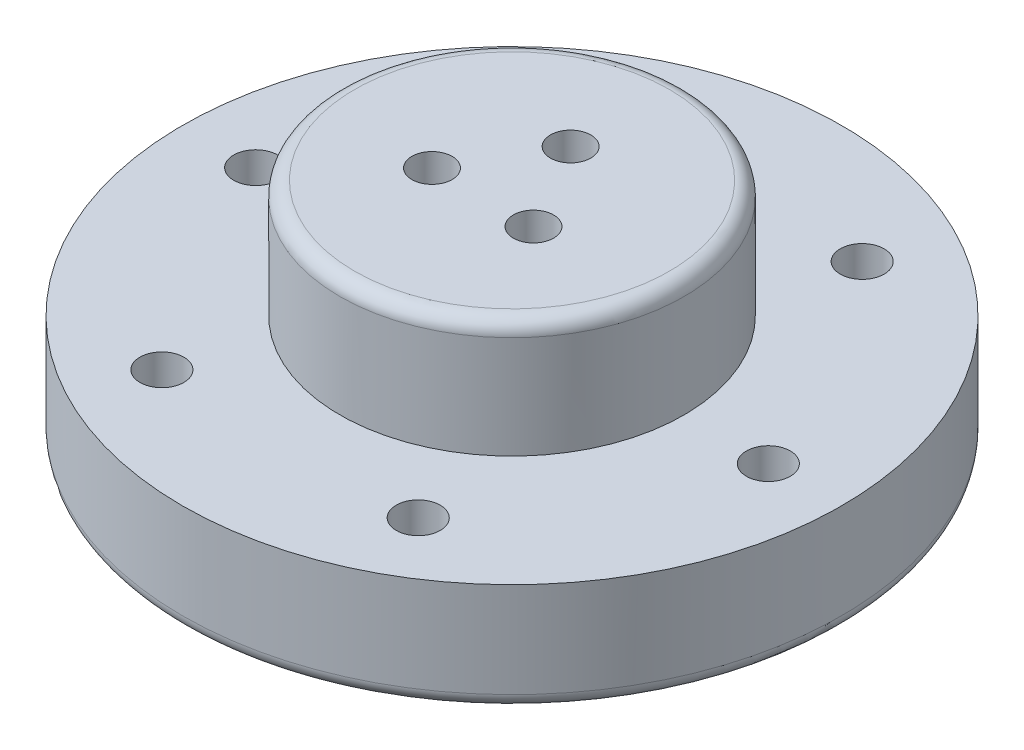
ISO-10303-21;
HEADER;
FILE_DESCRIPTION(('STEP AP214'),'2;1');
FILE_NAME('part.step','',(''),(''),'','','');
FILE_SCHEMA(('AUTOMOTIVE_DESIGN { 1 0 10303 214 1 1 1 1 }'));
ENDSEC;
DATA;
#1=APPLICATION_CONTEXT('core data for automotive mechanical design processes');
#2=APPLICATION_PROTOCOL_DEFINITION('international standard','automotive_design',2000,#1);
#3=PRODUCT_CONTEXT('',#1,'mechanical');
#4=PRODUCT('Part','Part','',(#3));
#5=PRODUCT_RELATED_PRODUCT_CATEGORY('part','',(#4));
#6=PRODUCT_DEFINITION_FORMATION('','',#4);
#7=PRODUCT_DEFINITION_CONTEXT('part definition',#1,'design');
#8=PRODUCT_DEFINITION('design','',#6,#7);
#9=PRODUCT_DEFINITION_SHAPE('','',#8);
#10=(LENGTH_UNIT() NAMED_UNIT(*) SI_UNIT(.MILLI.,.METRE.));
#11=(NAMED_UNIT(*) PLANE_ANGLE_UNIT() SI_UNIT($,.RADIAN.));
#12=(NAMED_UNIT(*) SI_UNIT($,.STERADIAN.) SOLID_ANGLE_UNIT());
#13=UNCERTAINTY_MEASURE_WITH_UNIT(LENGTH_MEASURE(1.E-05),#10,'distance_accuracy_value','');
#14=(GEOMETRIC_REPRESENTATION_CONTEXT(3) GLOBAL_UNCERTAINTY_ASSIGNED_CONTEXT((#13)) GLOBAL_UNIT_ASSIGNED_CONTEXT((#10,
#11,#12)) REPRESENTATION_CONTEXT('',''));
#15=CARTESIAN_POINT('',(0.,0.,0.));
#16=DIRECTION('',(0.,0.,1.));
#17=DIRECTION('',(1.,0.,0.));
#18=AXIS2_PLACEMENT_3D('',#15,#16,#17);
#19=CARTESIAN_POINT('',(0.,14.,0.));
#20=DIRECTION('',(0.,-1.,0.));
#21=DIRECTION('',(0.,0.,-1.));
#22=AXIS2_PLACEMENT_3D('',#19,#20,#21);
#23=CYLINDRICAL_SURFACE('',#22,23.5);
#24=CARTESIAN_POINT('',(0.,14.,0.));
#25=DIRECTION('',(0.,1.,0.));
#26=DIRECTION('',(0.,0.,1.));
#27=AXIS2_PLACEMENT_3D('',#24,#25,#26);
#28=CIRCLE('',#27,23.5);
#29=CARTESIAN_POINT('',(0.,14.,23.5));
#30=VERTEX_POINT('',#29);
#31=EDGE_CURVE('E53',#30,#30,#28,.F.);
#32=ORIENTED_EDGE('',*,*,#31,.T.);
#33=EDGE_LOOP('',(#32));
#34=FACE_BOUND('',#33,.T.);
#35=CARTESIAN_POINT('',(0.,0.,0.));
#36=DIRECTION('',(0.,-1.,0.));
#37=DIRECTION('',(0.,0.,-1.));
#38=AXIS2_PLACEMENT_3D('',#35,#36,#37);
#39=CIRCLE('',#38,23.5);
#40=CARTESIAN_POINT('',(0.,0.,-23.5));
#41=VERTEX_POINT('',#40);
#42=EDGE_CURVE('E96',#41,#41,#39,.T.);
#43=ORIENTED_EDGE('',*,*,#42,.F.);
#44=EDGE_LOOP('',(#43));
#45=FACE_BOUND('',#44,.T.);
#46=ADVANCED_FACE('F40',(#34,#45),#23,.T.);
#47=CARTESIAN_POINT('',(0.,-15.,0.));
#48=DIRECTION('',(0.,-1.,0.));
#49=DIRECTION('',(0.,0.,-1.));
#50=AXIS2_PLACEMENT_3D('',#47,#48,#49);
#51=PLANE('',#50);
#52=CARTESIAN_POINT('',(0.,-15.,0.));
#53=DIRECTION('',(0.,-1.,0.));
#54=DIRECTION('',(0.,0.,-1.));
#55=AXIS2_PLACEMENT_3D('',#52,#53,#54);
#56=CIRCLE('',#55,22.05);
#57=CARTESIAN_POINT('',(0.,-15.,-22.05));
#58=VERTEX_POINT('',#57);
#59=EDGE_CURVE('E10',#58,#58,#56,.F.);
#60=ORIENTED_EDGE('',*,*,#59,.T.);
#61=EDGE_LOOP('',(#60));
#62=FACE_BOUND('',#61,.T.);
#63=CARTESIAN_POINT('',(0.,-15.,0.));
#64=DIRECTION('',(0.,-1.,0.));
#65=DIRECTION('',(0.,0.,-1.));
#66=AXIS2_PLACEMENT_3D('',#63,#64,#65);
#67=CIRCLE('',#66,43.);
#68=CARTESIAN_POINT('',(0.,-15.,-43.));
#69=VERTEX_POINT('',#68);
#70=EDGE_CURVE('E64',#69,#69,#67,.T.);
#71=ORIENTED_EDGE('',*,*,#70,.T.);
#72=EDGE_LOOP('',(#71));
#73=FACE_BOUND('',#72,.T.);
#74=CARTESIAN_POINT('',(-17.4995000000004,-15.,30.3117551578589));
#75=DIRECTION('',(0.,1.,0.));
#76=DIRECTION('',(0.,0.,1.));
#77=AXIS2_PLACEMENT_3D('',#74,#75,#76);
#78=CIRCLE('',#77,3.);
#79=CARTESIAN_POINT('',(-17.4995000000004,-15.,33.3117551578589));
#80=VERTEX_POINT('',#79);
#81=EDGE_CURVE('E177',#80,#80,#78,.T.);
#82=ORIENTED_EDGE('',*,*,#81,.T.);
#83=EDGE_LOOP('',(#82));
#84=FACE_BOUND('',#83,.T.);
#85=CARTESIAN_POINT('',(17.5014999999997,-15.,30.3117551578593));
#86=DIRECTION('',(0.,1.,0.));
#87=DIRECTION('',(0.,0.,1.));
#88=AXIS2_PLACEMENT_3D('',#85,#86,#87);
#89=CIRCLE('',#88,3.);
#90=CARTESIAN_POINT('',(17.5014999999997,-15.,33.3117551578593));
#91=VERTEX_POINT('',#90);
#92=EDGE_CURVE('E169',#91,#91,#89,.T.);
#93=ORIENTED_EDGE('',*,*,#92,.T.);
#94=EDGE_LOOP('',(#93));
#95=FACE_BOUND('',#94,.T.);
#96=CARTESIAN_POINT('',(35.002,-15.,2.44410676681697E-13));
#97=DIRECTION('',(0.,1.,0.));
#98=DIRECTION('',(0.,0.,1.));
#99=AXIS2_PLACEMENT_3D('',#96,#97,#98);
#100=CIRCLE('',#99,3.);
#101=CARTESIAN_POINT('',(35.002,-15.,3.00000000000025));
#102=VERTEX_POINT('',#101);
#103=EDGE_CURVE('E161',#102,#102,#100,.T.);
#104=ORIENTED_EDGE('',*,*,#103,.T.);
#105=EDGE_LOOP('',(#104));
#106=FACE_BOUND('',#105,.T.);
#107=CARTESIAN_POINT('',(17.5015000000001,-15.,-30.3117551578591));
#108=DIRECTION('',(0.,1.,0.));
#109=DIRECTION('',(0.,0.,1.));
#110=AXIS2_PLACEMENT_3D('',#107,#108,#109);
#111=CIRCLE('',#110,3.);
#112=CARTESIAN_POINT('',(17.5015000000001,-15.,-27.3117551578591));
#113=VERTEX_POINT('',#112);
#114=EDGE_CURVE('E153',#113,#113,#111,.T.);
#115=ORIENTED_EDGE('',*,*,#114,.T.);
#116=EDGE_LOOP('',(#115));
#117=FACE_BOUND('',#116,.T.);
#118=CARTESIAN_POINT('',(-17.4994999999999,-15.,-30.3117551578592));
#119=DIRECTION('',(0.,1.,0.));
#120=DIRECTION('',(0.,0.,1.));
#121=AXIS2_PLACEMENT_3D('',#118,#119,#120);
#122=CIRCLE('',#121,3.);
#123=CARTESIAN_POINT('',(-17.4994999999999,-15.,-27.3117551578592));
#124=VERTEX_POINT('',#123);
#125=EDGE_CURVE('E145',#124,#124,#122,.T.);
#126=ORIENTED_EDGE('',*,*,#125,.T.);
#127=EDGE_LOOP('',(#126));
#128=FACE_BOUND('',#127,.T.);
#129=CARTESIAN_POINT('',(-35.,-15.,0.));
#130=DIRECTION('',(0.,1.,0.));
#131=DIRECTION('',(0.,0.,1.));
#132=AXIS2_PLACEMENT_3D('',#129,#130,#131);
#133=CIRCLE('',#132,3.);
#134=CARTESIAN_POINT('',(-35.,-15.,3.));
#135=VERTEX_POINT('',#134);
#136=EDGE_CURVE('E140',#135,#135,#133,.T.);
#137=ORIENTED_EDGE('',*,*,#136,.T.);
#138=EDGE_LOOP('',(#137));
#139=FACE_BOUND('',#138,.T.);
#140=ADVANCED_FACE('F189',(#62,#73,#84,#95,#106,#117,#128,#139),#51,.T.);
#141=CARTESIAN_POINT('',(0.,0.,0.));
#142=DIRECTION('',(0.,-1.,0.));
#143=DIRECTION('',(0.,0.,-1.));
#144=AXIS2_PLACEMENT_3D('',#141,#142,#143);
#145=PLANE('',#144);
#146=ORIENTED_EDGE('',*,*,#42,.T.);
#147=EDGE_LOOP('',(#146));
#148=FACE_BOUND('',#147,.T.);
#149=CARTESIAN_POINT('',(-17.4995000000004,0.,30.3117551578589));
#150=DIRECTION('',(0.,1.,0.));
#151=DIRECTION('',(0.,0.,1.));
#152=AXIS2_PLACEMENT_3D('',#149,#150,#151);
#153=CIRCLE('',#152,3.);
#154=CARTESIAN_POINT('',(-17.4995000000004,0.,33.3117551578589));
#155=VERTEX_POINT('',#154);
#156=EDGE_CURVE('E181',#155,#155,#153,.T.);
#157=ORIENTED_EDGE('',*,*,#156,.F.);
#158=EDGE_LOOP('',(#157));
#159=FACE_BOUND('',#158,.T.);
#160=CARTESIAN_POINT('',(17.5014999999997,0.,30.3117551578593));
#161=DIRECTION('',(0.,1.,0.));
#162=DIRECTION('',(0.,0.,1.));
#163=AXIS2_PLACEMENT_3D('',#160,#161,#162);
#164=CIRCLE('',#163,3.);
#165=CARTESIAN_POINT('',(17.5014999999997,0.,33.3117551578593));
#166=VERTEX_POINT('',#165);
#167=EDGE_CURVE('E173',#166,#166,#164,.T.);
#168=ORIENTED_EDGE('',*,*,#167,.F.);
#169=EDGE_LOOP('',(#168));
#170=FACE_BOUND('',#169,.T.);
#171=CARTESIAN_POINT('',(35.002,0.,2.44410676681697E-13));
#172=DIRECTION('',(0.,1.,0.));
#173=DIRECTION('',(0.,0.,1.));
#174=AXIS2_PLACEMENT_3D('',#171,#172,#173);
#175=CIRCLE('',#174,3.);
#176=CARTESIAN_POINT('',(35.002,0.,3.00000000000025));
#177=VERTEX_POINT('',#176);
#178=EDGE_CURVE('E165',#177,#177,#175,.T.);
#179=ORIENTED_EDGE('',*,*,#178,.F.);
#180=EDGE_LOOP('',(#179));
#181=FACE_BOUND('',#180,.T.);
#182=CARTESIAN_POINT('',(17.5015000000001,0.,-30.3117551578591));
#183=DIRECTION('',(0.,1.,0.));
#184=DIRECTION('',(0.,0.,1.));
#185=AXIS2_PLACEMENT_3D('',#182,#183,#184);
#186=CIRCLE('',#185,3.);
#187=CARTESIAN_POINT('',(17.5015000000001,0.,-27.3117551578591));
#188=VERTEX_POINT('',#187);
#189=EDGE_CURVE('E157',#188,#188,#186,.T.);
#190=ORIENTED_EDGE('',*,*,#189,.F.);
#191=EDGE_LOOP('',(#190));
#192=FACE_BOUND('',#191,.T.);
#193=CARTESIAN_POINT('',(-17.4994999999999,0.,-30.3117551578592));
#194=DIRECTION('',(0.,1.,0.));
#195=DIRECTION('',(0.,0.,1.));
#196=AXIS2_PLACEMENT_3D('',#193,#194,#195);
#197=CIRCLE('',#196,3.);
#198=CARTESIAN_POINT('',(-17.4994999999999,0.,-27.3117551578592));
#199=VERTEX_POINT('',#198);
#200=EDGE_CURVE('E149',#199,#199,#197,.T.);
#201=ORIENTED_EDGE('',*,*,#200,.F.);
#202=EDGE_LOOP('',(#201));
#203=FACE_BOUND('',#202,.T.);
#204=CARTESIAN_POINT('',(-35.,0.,0.));
#205=DIRECTION('',(0.,1.,0.));
#206=DIRECTION('',(0.,0.,1.));
#207=AXIS2_PLACEMENT_3D('',#204,#205,#206);
#208=CIRCLE('',#207,3.);
#209=CARTESIAN_POINT('',(-35.,0.,3.));
#210=VERTEX_POINT('',#209);
#211=EDGE_CURVE('E141',#210,#210,#208,.T.);
#212=ORIENTED_EDGE('',*,*,#211,.F.);
#213=EDGE_LOOP('',(#212));
#214=FACE_BOUND('',#213,.T.);
#215=CARTESIAN_POINT('',(0.,0.,0.));
#216=DIRECTION('',(0.,1.,0.));
#217=DIRECTION('',(0.,0.,1.));
#218=AXIS2_PLACEMENT_3D('',#215,#216,#217);
#219=CIRCLE('',#218,45.);
#220=CARTESIAN_POINT('',(0.,0.,45.));
#221=VERTEX_POINT('',#220);
#222=EDGE_CURVE('E130',#221,#221,#219,.T.);
#223=ORIENTED_EDGE('',*,*,#222,.T.);
#224=EDGE_LOOP('',(#223));
#225=FACE_BOUND('',#224,.T.);
#226=ADVANCED_FACE('F200',(#148,#159,#170,#181,#192,#203,#214,#225),#145,.F.);
#227=CARTESIAN_POINT('',(0.,-15.,0.));
#228=DIRECTION('',(0.,1.,0.));
#229=DIRECTION('',(0.,0.,1.));
#230=AXIS2_PLACEMENT_3D('',#227,#228,#229);
#231=CYLINDRICAL_SURFACE('',#230,21.05);
#232=CARTESIAN_POINT('',(0.,-14.,0.));
#233=DIRECTION('',(0.,-1.,0.));
#234=DIRECTION('',(0.,0.,-1.));
#235=AXIS2_PLACEMENT_3D('',#232,#233,#234);
#236=CIRCLE('',#235,21.05);
#237=CARTESIAN_POINT('',(0.,-14.,-21.05));
#238=VERTEX_POINT('',#237);
#239=EDGE_CURVE('E48',#238,#238,#236,.T.);
#240=ORIENTED_EDGE('',*,*,#239,.T.);
#241=EDGE_LOOP('',(#240));
#242=FACE_BOUND('',#241,.T.);
#243=CARTESIAN_POINT('',(0.,0.,0.));
#244=DIRECTION('',(0.,-1.,0.));
#245=DIRECTION('',(0.,0.,-1.));
#246=AXIS2_PLACEMENT_3D('',#243,#244,#245);
#247=CIRCLE('',#246,21.05);
#248=CARTESIAN_POINT('',(0.,0.,-21.05));
#249=VERTEX_POINT('',#248);
#250=EDGE_CURVE('E100',#249,#249,#247,.T.);
#251=ORIENTED_EDGE('',*,*,#250,.F.);
#252=EDGE_LOOP('',(#251));
#253=FACE_BOUND('',#252,.T.);
#254=ADVANCED_FACE('F203',(#242,#253),#231,.F.);
#255=CARTESIAN_POINT('',(0.,0.,0.));
#256=DIRECTION('',(0.,1.,0.));
#257=DIRECTION('',(0.,0.,1.));
#258=AXIS2_PLACEMENT_3D('',#255,#256,#257);
#259=PLANE('',#258);
#260=CARTESIAN_POINT('',(0.,0.,-8.));
#261=DIRECTION('',(0.,-1.,0.));
#262=DIRECTION('',(0.,0.,-1.));
#263=AXIS2_PLACEMENT_3D('',#260,#261,#262);
#264=CIRCLE('',#263,1.5);
#265=CARTESIAN_POINT('',(0.,0.,-9.5));
#266=VERTEX_POINT('',#265);
#267=EDGE_CURVE('E109',#266,#266,#264,.T.);
#268=ORIENTED_EDGE('',*,*,#267,.F.);
#269=EDGE_LOOP('',(#268));
#270=FACE_BOUND('',#269,.T.);
#271=CARTESIAN_POINT('',(-6.92820323027602,0.,3.9999999999997));
#272=DIRECTION('',(0.,-1.,0.));
#273=DIRECTION('',(0.,0.,-1.));
#274=AXIS2_PLACEMENT_3D('',#271,#272,#273);
#275=CIRCLE('',#274,1.50000000000044);
#276=CARTESIAN_POINT('',(-6.92820323027602,0.,2.49999999999927));
#277=VERTEX_POINT('',#276);
#278=EDGE_CURVE('E117',#277,#277,#275,.T.);
#279=ORIENTED_EDGE('',*,*,#278,.F.);
#280=EDGE_LOOP('',(#279));
#281=FACE_BOUND('',#280,.T.);
#282=CARTESIAN_POINT('',(6.928203230275,0.,4.0000000000003));
#283=DIRECTION('',(0.,-1.,0.));
#284=DIRECTION('',(0.,0.,-1.));
#285=AXIS2_PLACEMENT_3D('',#282,#283,#284);
#286=CIRCLE('',#285,1.50000000000065);
#287=CARTESIAN_POINT('',(6.928203230275,0.,2.49999999999965));
#288=VERTEX_POINT('',#287);
#289=EDGE_CURVE('E113',#288,#288,#286,.T.);
#290=ORIENTED_EDGE('',*,*,#289,.F.);
#291=EDGE_LOOP('',(#290));
#292=FACE_BOUND('',#291,.T.);
#293=CARTESIAN_POINT('',(0.,0.,0.));
#294=DIRECTION('',(0.,-1.,0.));
#295=DIRECTION('',(0.,0.,-1.));
#296=AXIS2_PLACEMENT_3D('',#293,#294,#295);
#297=CIRCLE('',#296,5.65);
#298=CARTESIAN_POINT('',(0.,0.,-5.65));
#299=VERTEX_POINT('',#298);
#300=EDGE_CURVE('E105',#299,#299,#297,.T.);
#301=ORIENTED_EDGE('',*,*,#300,.F.);
#302=EDGE_LOOP('',(#301));
#303=FACE_BOUND('',#302,.T.);
#304=ORIENTED_EDGE('',*,*,#250,.T.);
#305=EDGE_LOOP('',(#304));
#306=FACE_BOUND('',#305,.T.);
#307=ADVANCED_FACE('F248',(#270,#281,#292,#303,#306),#259,.F.);
#308=CARTESIAN_POINT('',(0.,7.5,0.));
#309=DIRECTION('',(0.,-1.,0.));
#310=DIRECTION('',(0.,0.,-1.));
#311=AXIS2_PLACEMENT_3D('',#308,#309,#310);
#312=CYLINDRICAL_SURFACE('',#311,5.65);
#313=CARTESIAN_POINT('',(0.,7.5,0.));
#314=DIRECTION('',(0.,-1.,0.));
#315=DIRECTION('',(0.,0.,-1.));
#316=AXIS2_PLACEMENT_3D('',#313,#314,#315);
#317=CIRCLE('',#316,5.65);
#318=CARTESIAN_POINT('',(0.,7.5,-5.65));
#319=VERTEX_POINT('',#318);
#320=EDGE_CURVE('E104',#319,#319,#317,.T.);
#321=ORIENTED_EDGE('',*,*,#320,.F.);
#322=EDGE_LOOP('',(#321));
#323=FACE_BOUND('',#322,.T.);
#324=ORIENTED_EDGE('',*,*,#300,.T.);
#325=EDGE_LOOP('',(#324));
#326=FACE_BOUND('',#325,.T.);
#327=ADVANCED_FACE('F315',(#323,#326),#312,.F.);
#328=CARTESIAN_POINT('',(0.,7.5,0.));
#329=DIRECTION('',(0.,-1.,0.));
#330=DIRECTION('',(0.,0.,-1.));
#331=AXIS2_PLACEMENT_3D('',#328,#329,#330);
#332=PLANE('',#331);
#333=ORIENTED_EDGE('',*,*,#320,.T.);
#334=EDGE_LOOP('',(#333));
#335=FACE_BOUND('',#334,.T.);
#336=ADVANCED_FACE('F311',(#335),#332,.T.);
#337=CARTESIAN_POINT('',(6.928203230275,7.5,4.0000000000003));
#338=DIRECTION('',(0.,-1.,0.));
#339=DIRECTION('',(0.,0.,-1.));
#340=AXIS2_PLACEMENT_3D('',#337,#338,#339);
#341=CYLINDRICAL_SURFACE('',#340,1.50000000000065);
#342=CARTESIAN_POINT('',(6.928203230275,8.69999999999998,4.0000000000003));
#343=DIRECTION('',(0.,1.,0.));
#344=DIRECTION('',(0.,0.,1.));
#345=AXIS2_PLACEMENT_3D('',#342,#343,#344);
#346=CIRCLE('',#345,1.50000000000065);
#347=CARTESIAN_POINT('',(6.928203230275,8.69999999999998,5.50000000000095));
#348=VERTEX_POINT('',#347);
#349=EDGE_CURVE('E84',#348,#348,#346,.T.);
#350=ORIENTED_EDGE('',*,*,#349,.T.);
#351=EDGE_LOOP('',(#350));
#352=FACE_BOUND('',#351,.T.);
#353=ORIENTED_EDGE('',*,*,#289,.T.);
#354=EDGE_LOOP('',(#353));
#355=FACE_BOUND('',#354,.T.);
#356=ADVANCED_FACE('F307',(#352,#355),#341,.F.);
#357=CARTESIAN_POINT('',(-6.92820323027602,7.5,3.9999999999997));
#358=DIRECTION('',(0.,-1.,0.));
#359=DIRECTION('',(0.,0.,-1.));
#360=AXIS2_PLACEMENT_3D('',#357,#358,#359);
#361=CYLINDRICAL_SURFACE('',#360,1.50000000000044);
#362=CARTESIAN_POINT('',(-6.92820323027602,8.69999999999998,3.9999999999997));
#363=DIRECTION('',(0.,1.,0.));
#364=DIRECTION('',(0.,0.,1.));
#365=AXIS2_PLACEMENT_3D('',#362,#363,#364);
#366=CIRCLE('',#365,1.50000000000044);
#367=CARTESIAN_POINT('',(-6.92820323027602,8.69999999999998,5.50000000000014));
#368=VERTEX_POINT('',#367);
#369=EDGE_CURVE('E88',#368,#368,#366,.T.);
#370=ORIENTED_EDGE('',*,*,#369,.T.);
#371=EDGE_LOOP('',(#370));
#372=FACE_BOUND('',#371,.T.);
#373=ORIENTED_EDGE('',*,*,#278,.T.);
#374=EDGE_LOOP('',(#373));
#375=FACE_BOUND('',#374,.T.);
#376=ADVANCED_FACE('F303',(#372,#375),#361,.F.);
#377=CARTESIAN_POINT('',(0.,7.5,-8.));
#378=DIRECTION('',(0.,-1.,0.));
#379=DIRECTION('',(0.,0.,-1.));
#380=AXIS2_PLACEMENT_3D('',#377,#378,#379);
#381=CYLINDRICAL_SURFACE('',#380,1.5);
#382=CARTESIAN_POINT('',(0.,8.69999999999998,-8.));
#383=DIRECTION('',(0.,1.,0.));
#384=DIRECTION('',(0.,0.,1.));
#385=AXIS2_PLACEMENT_3D('',#382,#383,#384);
#386=CIRCLE('',#385,1.5);
#387=CARTESIAN_POINT('',(0.,8.69999999999998,-6.5));
#388=VERTEX_POINT('',#387);
#389=EDGE_CURVE('E92',#388,#388,#386,.T.);
#390=ORIENTED_EDGE('',*,*,#389,.T.);
#391=EDGE_LOOP('',(#390));
#392=FACE_BOUND('',#391,.T.);
#393=ORIENTED_EDGE('',*,*,#267,.T.);
#394=EDGE_LOOP('',(#393));
#395=FACE_BOUND('',#394,.T.);
#396=ADVANCED_FACE('F282',(#392,#395),#381,.F.);
#397=CARTESIAN_POINT('',(0.,16.,0.));
#398=DIRECTION('',(0.,1.,0.));
#399=DIRECTION('',(0.,0.,1.));
#400=AXIS2_PLACEMENT_3D('',#397,#398,#399);
#401=PLANE('',#400);
#402=CARTESIAN_POINT('',(0.,16.,0.));
#403=DIRECTION('',(0.,1.,0.));
#404=DIRECTION('',(0.,0.,1.));
#405=AXIS2_PLACEMENT_3D('',#402,#403,#404);
#406=CIRCLE('',#405,21.5);
#407=CARTESIAN_POINT('',(0.,16.,21.5));
#408=VERTEX_POINT('',#407);
#409=EDGE_CURVE('E58',#408,#408,#406,.T.);
#410=ORIENTED_EDGE('',*,*,#409,.T.);
#411=EDGE_LOOP('',(#410));
#412=FACE_BOUND('',#411,.T.);
#413=CARTESIAN_POINT('',(0.,16.,-8.));
#414=DIRECTION('',(0.,1.,0.));
#415=DIRECTION('',(0.,0.,1.));
#416=AXIS2_PLACEMENT_3D('',#413,#414,#415);
#417=CIRCLE('',#416,2.75);
#418=CARTESIAN_POINT('',(0.,16.,-5.25));
#419=VERTEX_POINT('',#418);
#420=EDGE_CURVE('E118',#419,#419,#417,.T.);
#421=ORIENTED_EDGE('',*,*,#420,.F.);
#422=EDGE_LOOP('',(#421));
#423=FACE_BOUND('',#422,.T.);
#424=CARTESIAN_POINT('',(6.928203230275,16.,4.0000000000003));
#425=DIRECTION('',(0.,1.,0.));
#426=DIRECTION('',(0.,0.,1.));
#427=AXIS2_PLACEMENT_3D('',#424,#425,#426);
#428=CIRCLE('',#427,2.75);
#429=CARTESIAN_POINT('',(6.928203230275,16.,6.7500000000003));
#430=VERTEX_POINT('',#429);
#431=EDGE_CURVE('E129',#430,#430,#428,.T.);
#432=ORIENTED_EDGE('',*,*,#431,.F.);
#433=EDGE_LOOP('',(#432));
#434=FACE_BOUND('',#433,.T.);
#435=CARTESIAN_POINT('',(-6.92820323027602,16.,3.9999999999997));
#436=DIRECTION('',(0.,1.,0.));
#437=DIRECTION('',(0.,0.,1.));
#438=AXIS2_PLACEMENT_3D('',#435,#436,#437);
#439=CIRCLE('',#438,2.75);
#440=CARTESIAN_POINT('',(-6.92820323027602,16.,6.7499999999997));
#441=VERTEX_POINT('',#440);
#442=EDGE_CURVE('E125',#441,#441,#439,.T.);
#443=ORIENTED_EDGE('',*,*,#442,.F.);
#444=EDGE_LOOP('',(#443));
#445=FACE_BOUND('',#444,.T.);
#446=ADVANCED_FACE('F279',(#412,#423,#434,#445),#401,.T.);
#447=CARTESIAN_POINT('',(-6.92820323027602,10.,3.9999999999997));
#448=DIRECTION('',(0.,1.,0.));
#449=DIRECTION('',(0.,0.,1.));
#450=AXIS2_PLACEMENT_3D('',#447,#448,#449);
#451=CYLINDRICAL_SURFACE('',#450,2.75);
#452=CARTESIAN_POINT('',(-6.92820323027602,9.94999999999955,3.9999999999997));
#453=DIRECTION('',(0.,1.,0.));
#454=DIRECTION('',(0.,0.,1.));
#455=AXIS2_PLACEMENT_3D('',#452,#453,#454);
#456=CIRCLE('',#455,2.75);
#457=CARTESIAN_POINT('',(-6.92820323027602,9.94999999999955,6.7499999999997));
#458=VERTEX_POINT('',#457);
#459=EDGE_CURVE('E76',#458,#458,#456,.F.);
#460=ORIENTED_EDGE('',*,*,#459,.T.);
#461=EDGE_LOOP('',(#460));
#462=FACE_BOUND('',#461,.T.);
#463=ORIENTED_EDGE('',*,*,#442,.T.);
#464=EDGE_LOOP('',(#463));
#465=FACE_BOUND('',#464,.T.);
#466=ADVANCED_FACE('F281',(#462,#465),#451,.F.);
#467=CARTESIAN_POINT('',(6.928203230275,10.,4.0000000000003));
#468=DIRECTION('',(0.,1.,0.));
#469=DIRECTION('',(0.,0.,1.));
#470=AXIS2_PLACEMENT_3D('',#467,#468,#469);
#471=CYLINDRICAL_SURFACE('',#470,2.75);
#472=CARTESIAN_POINT('',(6.928203230275,9.94999999999934,4.0000000000003));
#473=DIRECTION('',(0.,1.,0.));
#474=DIRECTION('',(0.,0.,1.));
#475=AXIS2_PLACEMENT_3D('',#472,#473,#474);
#476=CIRCLE('',#475,2.75);
#477=CARTESIAN_POINT('',(6.928203230275,9.94999999999934,6.7500000000003));
#478=VERTEX_POINT('',#477);
#479=EDGE_CURVE('E72',#478,#478,#476,.F.);
#480=ORIENTED_EDGE('',*,*,#479,.T.);
#481=EDGE_LOOP('',(#480));
#482=FACE_BOUND('',#481,.T.);
#483=ORIENTED_EDGE('',*,*,#431,.T.);
#484=EDGE_LOOP('',(#483));
#485=FACE_BOUND('',#484,.T.);
#486=ADVANCED_FACE('F291',(#482,#485),#471,.F.);
#487=CARTESIAN_POINT('',(0.,10.,-8.));
#488=DIRECTION('',(0.,1.,0.));
#489=DIRECTION('',(0.,0.,1.));
#490=AXIS2_PLACEMENT_3D('',#487,#488,#489);
#491=CYLINDRICAL_SURFACE('',#490,2.75);
#492=CARTESIAN_POINT('',(0.,9.94999999999999,-8.));
#493=DIRECTION('',(0.,1.,0.));
#494=DIRECTION('',(0.,0.,1.));
#495=AXIS2_PLACEMENT_3D('',#492,#493,#494);
#496=CIRCLE('',#495,2.75);
#497=CARTESIAN_POINT('',(0.,9.94999999999999,-5.25));
#498=VERTEX_POINT('',#497);
#499=EDGE_CURVE('E80',#498,#498,#496,.F.);
#500=ORIENTED_EDGE('',*,*,#499,.T.);
#501=EDGE_LOOP('',(#500));
#502=FACE_BOUND('',#501,.T.);
#503=ORIENTED_EDGE('',*,*,#420,.T.);
#504=EDGE_LOOP('',(#503));
#505=FACE_BOUND('',#504,.T.);
#506=ADVANCED_FACE('F256',(#502,#505),#491,.F.);
#507=CARTESIAN_POINT('',(0.,8.69999999999998,-8.));
#508=DIRECTION('',(0.,1.,0.));
#509=DIRECTION('',(0.,0.,1.));
#510=AXIS2_PLACEMENT_3D('',#507,#508,#509);
#511=CONICAL_SURFACE('',#510,1.5,0.785398163397443);
#512=ORIENTED_EDGE('',*,*,#499,.F.);
#513=EDGE_LOOP('',(#512));
#514=FACE_BOUND('',#513,.T.);
#515=ORIENTED_EDGE('',*,*,#389,.F.);
#516=EDGE_LOOP('',(#515));
#517=FACE_BOUND('',#516,.T.);
#518=ADVANCED_FACE('F250',(#514,#517),#511,.F.);
#519=CARTESIAN_POINT('',(-6.92820323027602,8.69999999999998,3.9999999999997));
#520=DIRECTION('',(0.,1.,0.));
#521=DIRECTION('',(0.,0.,1.));
#522=AXIS2_PLACEMENT_3D('',#519,#520,#521);
#523=CONICAL_SURFACE('',#522,1.50000000000044,0.785398163397443);
#524=ORIENTED_EDGE('',*,*,#459,.F.);
#525=EDGE_LOOP('',(#524));
#526=FACE_BOUND('',#525,.T.);
#527=ORIENTED_EDGE('',*,*,#369,.F.);
#528=EDGE_LOOP('',(#527));
#529=FACE_BOUND('',#528,.T.);
#530=ADVANCED_FACE('F233',(#526,#529),#523,.F.);
#531=CARTESIAN_POINT('',(6.928203230275,8.69999999999998,4.0000000000003));
#532=DIRECTION('',(0.,1.,0.));
#533=DIRECTION('',(0.,0.,1.));
#534=AXIS2_PLACEMENT_3D('',#531,#532,#533);
#535=CONICAL_SURFACE('',#534,1.50000000000065,0.785398163397443);
#536=ORIENTED_EDGE('',*,*,#479,.F.);
#537=EDGE_LOOP('',(#536));
#538=FACE_BOUND('',#537,.T.);
#539=ORIENTED_EDGE('',*,*,#349,.F.);
#540=EDGE_LOOP('',(#539));
#541=FACE_BOUND('',#540,.T.);
#542=ADVANCED_FACE('F221',(#538,#541),#535,.F.);
#543=CARTESIAN_POINT('',(0.,-15.,0.));
#544=DIRECTION('',(0.,1.,0.));
#545=DIRECTION('',(0.,0.,1.));
#546=AXIS2_PLACEMENT_3D('',#543,#544,#545);
#547=CYLINDRICAL_SURFACE('',#546,45.);
#548=CARTESIAN_POINT('',(0.,-13.,0.));
#549=DIRECTION('',(0.,-1.,0.));
#550=DIRECTION('',(0.,0.,-1.));
#551=AXIS2_PLACEMENT_3D('',#548,#549,#550);
#552=CIRCLE('',#551,45.);
#553=CARTESIAN_POINT('',(0.,-13.,-45.));
#554=VERTEX_POINT('',#553);
#555=EDGE_CURVE('E68',#554,#554,#552,.F.);
#556=ORIENTED_EDGE('',*,*,#555,.T.);
#557=EDGE_LOOP('',(#556));
#558=FACE_BOUND('',#557,.T.);
#559=ORIENTED_EDGE('',*,*,#222,.F.);
#560=EDGE_LOOP('',(#559));
#561=FACE_BOUND('',#560,.T.);
#562=ADVANCED_FACE('F218',(#558,#561),#547,.T.);
#563=CARTESIAN_POINT('',(-35.,-15.,0.));
#564=DIRECTION('',(0.,1.,0.));
#565=DIRECTION('',(0.,0.,1.));
#566=AXIS2_PLACEMENT_3D('',#563,#564,#565);
#567=CYLINDRICAL_SURFACE('',#566,3.);
#568=ORIENTED_EDGE('',*,*,#136,.F.);
#569=EDGE_LOOP('',(#568));
#570=FACE_BOUND('',#569,.T.);
#571=ORIENTED_EDGE('',*,*,#211,.T.);
#572=EDGE_LOOP('',(#571));
#573=FACE_BOUND('',#572,.T.);
#574=ADVANCED_FACE('F220',(#570,#573),#567,.F.);
#575=CARTESIAN_POINT('',(-17.4994999999999,-15.,-30.3117551578592));
#576=DIRECTION('',(0.,1.,0.));
#577=DIRECTION('',(0.,0.,1.));
#578=AXIS2_PLACEMENT_3D('',#575,#576,#577);
#579=CYLINDRICAL_SURFACE('',#578,3.);
#580=ORIENTED_EDGE('',*,*,#125,.F.);
#581=EDGE_LOOP('',(#580));
#582=FACE_BOUND('',#581,.T.);
#583=ORIENTED_EDGE('',*,*,#200,.T.);
#584=EDGE_LOOP('',(#583));
#585=FACE_BOUND('',#584,.T.);
#586=ADVANCED_FACE('F229',(#582,#585),#579,.F.);
#587=CARTESIAN_POINT('',(17.5015000000001,-15.,-30.3117551578591));
#588=DIRECTION('',(0.,1.,0.));
#589=DIRECTION('',(0.,0.,1.));
#590=AXIS2_PLACEMENT_3D('',#587,#588,#589);
#591=CYLINDRICAL_SURFACE('',#590,3.);
#592=ORIENTED_EDGE('',*,*,#114,.F.);
#593=EDGE_LOOP('',(#592));
#594=FACE_BOUND('',#593,.T.);
#595=ORIENTED_EDGE('',*,*,#189,.T.);
#596=EDGE_LOOP('',(#595));
#597=FACE_BOUND('',#596,.T.);
#598=ADVANCED_FACE('F452',(#594,#597),#591,.F.);
#599=CARTESIAN_POINT('',(35.002,-15.,2.44410676681697E-13));
#600=DIRECTION('',(0.,1.,0.));
#601=DIRECTION('',(0.,0.,1.));
#602=AXIS2_PLACEMENT_3D('',#599,#600,#601);
#603=CYLINDRICAL_SURFACE('',#602,3.);
#604=ORIENTED_EDGE('',*,*,#103,.F.);
#605=EDGE_LOOP('',(#604));
#606=FACE_BOUND('',#605,.T.);
#607=ORIENTED_EDGE('',*,*,#178,.T.);
#608=EDGE_LOOP('',(#607));
#609=FACE_BOUND('',#608,.T.);
#610=ADVANCED_FACE('F461',(#606,#609),#603,.F.);
#611=CARTESIAN_POINT('',(17.5014999999997,-15.,30.3117551578593));
#612=DIRECTION('',(0.,1.,0.));
#613=DIRECTION('',(0.,0.,1.));
#614=AXIS2_PLACEMENT_3D('',#611,#612,#613);
#615=CYLINDRICAL_SURFACE('',#614,3.);
#616=ORIENTED_EDGE('',*,*,#92,.F.);
#617=EDGE_LOOP('',(#616));
#618=FACE_BOUND('',#617,.T.);
#619=ORIENTED_EDGE('',*,*,#167,.T.);
#620=EDGE_LOOP('',(#619));
#621=FACE_BOUND('',#620,.T.);
#622=ADVANCED_FACE('F196',(#618,#621),#615,.F.);
#623=CARTESIAN_POINT('',(-17.4995000000004,-15.,30.3117551578589));
#624=DIRECTION('',(0.,1.,0.));
#625=DIRECTION('',(0.,0.,1.));
#626=AXIS2_PLACEMENT_3D('',#623,#624,#625);
#627=CYLINDRICAL_SURFACE('',#626,3.);
#628=ORIENTED_EDGE('',*,*,#81,.F.);
#629=EDGE_LOOP('',(#628));
#630=FACE_BOUND('',#629,.T.);
#631=ORIENTED_EDGE('',*,*,#156,.T.);
#632=EDGE_LOOP('',(#631));
#633=FACE_BOUND('',#632,.T.);
#634=ADVANCED_FACE('F192',(#630,#633),#627,.F.);
#635=CARTESIAN_POINT('',(0.,-13.,0.));
#636=DIRECTION('',(0.,-1.,0.));
#637=DIRECTION('',(0.,0.,-1.));
#638=AXIS2_PLACEMENT_3D('',#635,#636,#637);
#639=TOROIDAL_SURFACE('',#638,43.,2.);
#640=ORIENTED_EDGE('',*,*,#70,.F.);
#641=EDGE_LOOP('',(#640));
#642=FACE_BOUND('',#641,.T.);
#643=ORIENTED_EDGE('',*,*,#555,.F.);
#644=EDGE_LOOP('',(#643));
#645=FACE_BOUND('',#644,.T.);
#646=ADVANCED_FACE('F195',(#642,#645),#639,.T.);
#647=CARTESIAN_POINT('',(0.,14.,0.));
#648=DIRECTION('',(0.,1.,0.));
#649=DIRECTION('',(0.,0.,1.));
#650=AXIS2_PLACEMENT_3D('',#647,#648,#649);
#651=TOROIDAL_SURFACE('',#650,21.5,2.);
#652=ORIENTED_EDGE('',*,*,#31,.F.);
#653=EDGE_LOOP('',(#652));
#654=FACE_BOUND('',#653,.T.);
#655=ORIENTED_EDGE('',*,*,#409,.F.);
#656=EDGE_LOOP('',(#655));
#657=FACE_BOUND('',#656,.T.);
#658=ADVANCED_FACE('F267',(#654,#657),#651,.T.);
#659=CARTESIAN_POINT('',(0.,-14.,0.));
#660=DIRECTION('',(0.,-1.,0.));
#661=DIRECTION('',(0.,0.,-1.));
#662=AXIS2_PLACEMENT_3D('',#659,#660,#661);
#663=TOROIDAL_SURFACE('',#662,22.05,1.);
#664=ORIENTED_EDGE('',*,*,#59,.F.);
#665=EDGE_LOOP('',(#664));
#666=FACE_BOUND('',#665,.T.);
#667=ORIENTED_EDGE('',*,*,#239,.F.);
#668=EDGE_LOOP('',(#667));
#669=FACE_BOUND('',#668,.T.);
#670=ADVANCED_FACE('F42',(#666,#669),#663,.T.);
#671=CLOSED_SHELL('',(#46,#140,#226,#254,#307,#327,#336,#356,#376,#396,#446,#466,#486,#506,#518,
#530,#542,#562,#574,#586,#598,#610,#622,#634,#646,#658,#670));
#672=MANIFOLD_SOLID_BREP('B2',#671);
#673=ADVANCED_BREP_SHAPE_REPRESENTATION('',(#18,#672),#14);
#674=SHAPE_DEFINITION_REPRESENTATION(#9,#673);
ENDSEC;
END-ISO-10303-21;
